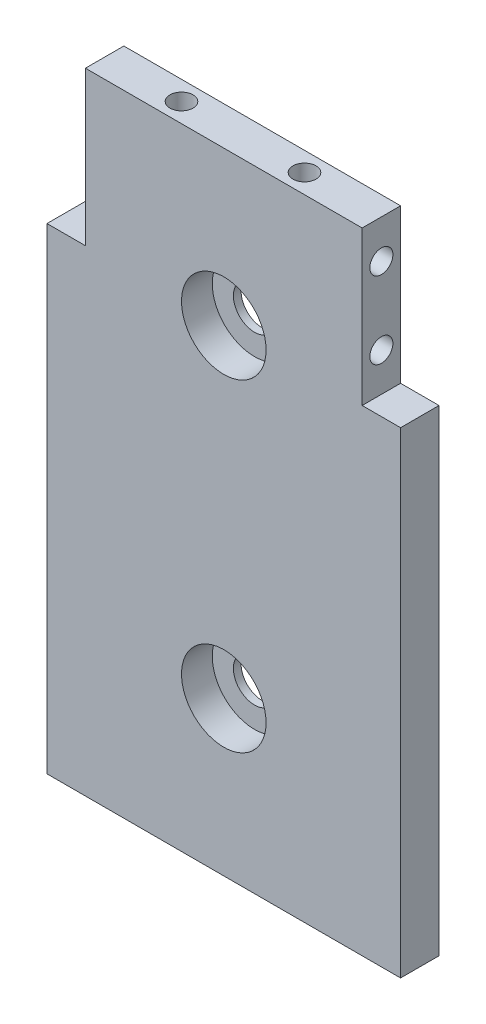
ISO-10303-21;
HEADER;
FILE_DESCRIPTION(('STEP AP214'),'2;1');
FILE_NAME('part.step','',(''),(''),'','','');
FILE_SCHEMA(('AUTOMOTIVE_DESIGN { 1 0 10303 214 1 1 1 1 }'));
ENDSEC;
DATA;
#1=APPLICATION_CONTEXT('core data for automotive mechanical design processes');
#2=APPLICATION_PROTOCOL_DEFINITION('international standard','automotive_design',2000,#1);
#3=PRODUCT_CONTEXT('',#1,'mechanical');
#4=PRODUCT('Part','Part','',(#3));
#5=PRODUCT_RELATED_PRODUCT_CATEGORY('part','',(#4));
#6=PRODUCT_DEFINITION_FORMATION('','',#4);
#7=PRODUCT_DEFINITION_CONTEXT('part definition',#1,'design');
#8=PRODUCT_DEFINITION('design','',#6,#7);
#9=PRODUCT_DEFINITION_SHAPE('','',#8);
#10=(LENGTH_UNIT() NAMED_UNIT(*) SI_UNIT(.MILLI.,.METRE.));
#11=(NAMED_UNIT(*) PLANE_ANGLE_UNIT() SI_UNIT($,.RADIAN.));
#12=(NAMED_UNIT(*) SI_UNIT($,.STERADIAN.) SOLID_ANGLE_UNIT());
#13=UNCERTAINTY_MEASURE_WITH_UNIT(LENGTH_MEASURE(1.E-05),#10,'distance_accuracy_value','');
#14=(GEOMETRIC_REPRESENTATION_CONTEXT(3) GLOBAL_UNCERTAINTY_ASSIGNED_CONTEXT((#13)) GLOBAL_UNIT_ASSIGNED_CONTEXT((#10,
#11,#12)) REPRESENTATION_CONTEXT('',''));
#15=CARTESIAN_POINT('',(0.,0.,0.));
#16=DIRECTION('',(0.,0.,1.));
#17=DIRECTION('',(1.,0.,0.));
#18=AXIS2_PLACEMENT_3D('',#15,#16,#17);
#19=CARTESIAN_POINT('',(23.,0.,5.));
#20=DIRECTION('',(0.,0.,-1.));
#21=DIRECTION('',(-1.,0.,0.));
#22=AXIS2_PLACEMENT_3D('',#19,#20,#21);
#23=CYLINDRICAL_SURFACE('',#22,2.75);
#24=CARTESIAN_POINT('',(23.,0.,0.));
#25=DIRECTION('',(0.,0.,1.));
#26=DIRECTION('',(1.,0.,0.));
#27=AXIS2_PLACEMENT_3D('',#24,#25,#26);
#28=CIRCLE('',#27,2.75);
#29=CARTESIAN_POINT('',(25.75,0.,0.));
#30=VERTEX_POINT('',#29);
#31=EDGE_CURVE('E135',#30,#30,#28,.T.);
#32=ORIENTED_EDGE('',*,*,#31,.F.);
#33=EDGE_LOOP('',(#32));
#34=FACE_BOUND('',#33,.T.);
#35=CARTESIAN_POINT('',(23.,0.,1.));
#36=DIRECTION('',(0.,0.,1.));
#37=DIRECTION('',(1.,0.,0.));
#38=AXIS2_PLACEMENT_3D('',#35,#36,#37);
#39=CIRCLE('',#38,2.75);
#40=CARTESIAN_POINT('',(25.75,0.,1.));
#41=VERTEX_POINT('',#40);
#42=EDGE_CURVE('E38',#41,#41,#39,.T.);
#43=ORIENTED_EDGE('',*,*,#42,.T.);
#44=EDGE_LOOP('',(#43));
#45=FACE_BOUND('',#44,.T.);
#46=ADVANCED_FACE('F35',(#34,#45),#23,.F.);
#47=CARTESIAN_POINT('',(23.,42.,5.));
#48=DIRECTION('',(0.,0.,-1.));
#49=DIRECTION('',(-1.,0.,0.));
#50=AXIS2_PLACEMENT_3D('',#47,#48,#49);
#51=CYLINDRICAL_SURFACE('',#50,2.75);
#52=CARTESIAN_POINT('',(23.,42.,0.));
#53=DIRECTION('',(0.,0.,1.));
#54=DIRECTION('',(1.,0.,0.));
#55=AXIS2_PLACEMENT_3D('',#52,#53,#54);
#56=CIRCLE('',#55,2.75);
#57=CARTESIAN_POINT('',(25.75,42.,0.));
#58=VERTEX_POINT('',#57);
#59=EDGE_CURVE('E155',#58,#58,#56,.T.);
#60=ORIENTED_EDGE('',*,*,#59,.F.);
#61=EDGE_LOOP('',(#60));
#62=FACE_BOUND('',#61,.T.);
#63=CARTESIAN_POINT('',(23.,42.,1.));
#64=DIRECTION('',(0.,0.,1.));
#65=DIRECTION('',(1.,0.,0.));
#66=AXIS2_PLACEMENT_3D('',#63,#64,#65);
#67=CIRCLE('',#66,2.75);
#68=CARTESIAN_POINT('',(25.75,42.,1.));
#69=VERTEX_POINT('',#68);
#70=EDGE_CURVE('E139',#69,#69,#67,.T.);
#71=ORIENTED_EDGE('',*,*,#70,.T.);
#72=EDGE_LOOP('',(#71));
#73=FACE_BOUND('',#72,.T.);
#74=ADVANCED_FACE('F204',(#62,#73),#51,.F.);
#75=CARTESIAN_POINT('',(0.,42.,5.));
#76=DIRECTION('',(0.,1.,0.));
#77=DIRECTION('',(0.,0.,1.));
#78=AXIS2_PLACEMENT_3D('',#75,#76,#77);
#79=PLANE('',#78);
#80=DIRECTION('',(1.,0.,0.));
#81=VECTOR('',#80,1.);
#82=CARTESIAN_POINT('',(0.,42.,0.));
#83=LINE('',#82,#81);
#84=CARTESIAN_POINT('',(41.,42.,0.));
#85=VERTEX_POINT('',#84);
#86=CARTESIAN_POINT('',(46.,42.,0.));
#87=VERTEX_POINT('',#86);
#88=EDGE_CURVE('E138',#85,#87,#83,.T.);
#89=ORIENTED_EDGE('',*,*,#88,.F.);
#90=DIRECTION('',(0.,0.,-1.));
#91=VECTOR('',#90,1.);
#92=CARTESIAN_POINT('',(41.,42.,5.));
#93=LINE('',#92,#91);
#94=CARTESIAN_POINT('',(41.,42.,5.));
#95=VERTEX_POINT('',#94);
#96=EDGE_CURVE('E11',#95,#85,#93,.T.);
#97=ORIENTED_EDGE('',*,*,#96,.F.);
#98=DIRECTION('',(1.,0.,0.));
#99=VECTOR('',#98,1.);
#100=CARTESIAN_POINT('',(0.,42.,5.));
#101=LINE('',#100,#99);
#102=CARTESIAN_POINT('',(46.,42.,5.));
#103=VERTEX_POINT('',#102);
#104=EDGE_CURVE('E130',#95,#103,#101,.T.);
#105=ORIENTED_EDGE('',*,*,#104,.T.);
#106=DIRECTION('',(0.,0.,-1.));
#107=VECTOR('',#106,1.);
#108=CARTESIAN_POINT('',(46.,42.,5.));
#109=LINE('',#108,#107);
#110=EDGE_CURVE('E88',#103,#87,#109,.T.);
#111=ORIENTED_EDGE('',*,*,#110,.T.);
#112=EDGE_LOOP('',(#89,#97,#105,#111));
#113=FACE_BOUND('',#112,.T.);
#114=ADVANCED_FACE('F206',(#113),#79,.T.);
#115=CARTESIAN_POINT('',(41.,0.,5.));
#116=DIRECTION('',(1.,0.,0.));
#117=DIRECTION('',(0.,0.,-1.));
#118=AXIS2_PLACEMENT_3D('',#115,#116,#117);
#119=PLANE('',#118);
#120=CARTESIAN_POINT('',(41.,57.,2.5));
#121=DIRECTION('',(1.,0.,0.));
#122=DIRECTION('',(0.,0.,-1.));
#123=AXIS2_PLACEMENT_3D('',#120,#121,#122);
#124=CIRCLE('',#123,1.5);
#125=CARTESIAN_POINT('',(41.,57.,0.999999999999999));
#126=VERTEX_POINT('',#125);
#127=EDGE_CURVE('E240',#126,#126,#124,.T.);
#128=ORIENTED_EDGE('',*,*,#127,.F.);
#129=EDGE_LOOP('',(#128));
#130=FACE_BOUND('',#129,.T.);
#131=CARTESIAN_POINT('',(41.,47.,2.5));
#132=DIRECTION('',(1.,0.,0.));
#133=DIRECTION('',(0.,0.,-1.));
#134=AXIS2_PLACEMENT_3D('',#131,#132,#133);
#135=CIRCLE('',#134,1.5);
#136=CARTESIAN_POINT('',(41.,47.,0.999999999999999));
#137=VERTEX_POINT('',#136);
#138=EDGE_CURVE('E244',#137,#137,#135,.T.);
#139=ORIENTED_EDGE('',*,*,#138,.F.);
#140=EDGE_LOOP('',(#139));
#141=FACE_BOUND('',#140,.T.);
#142=DIRECTION('',(0.,-1.,0.));
#143=VECTOR('',#142,1.);
#144=CARTESIAN_POINT('',(41.,0.,0.));
#145=LINE('',#144,#143);
#146=CARTESIAN_POINT('',(41.,62.,0.));
#147=VERTEX_POINT('',#146);
#148=EDGE_CURVE('E141',#147,#85,#145,.T.);
#149=ORIENTED_EDGE('',*,*,#148,.F.);
#150=DIRECTION('',(0.,0.,-1.));
#151=VECTOR('',#150,1.);
#152=CARTESIAN_POINT('',(41.,62.,5.));
#153=LINE('',#152,#151);
#154=CARTESIAN_POINT('',(41.,62.,5.));
#155=VERTEX_POINT('',#154);
#156=EDGE_CURVE('E44',#155,#147,#153,.T.);
#157=ORIENTED_EDGE('',*,*,#156,.F.);
#158=DIRECTION('',(0.,-1.,0.));
#159=VECTOR('',#158,1.);
#160=CARTESIAN_POINT('',(41.,0.,5.));
#161=LINE('',#160,#159);
#162=EDGE_CURVE('E180',#155,#95,#161,.T.);
#163=ORIENTED_EDGE('',*,*,#162,.T.);
#164=ORIENTED_EDGE('',*,*,#96,.T.);
#165=EDGE_LOOP('',(#149,#157,#163,#164));
#166=FACE_BOUND('',#165,.T.);
#167=ADVANCED_FACE('F212',(#130,#141,#166),#119,.T.);
#168=CARTESIAN_POINT('',(0.,62.,5.));
#169=DIRECTION('',(0.,1.,0.));
#170=DIRECTION('',(0.,0.,1.));
#171=AXIS2_PLACEMENT_3D('',#168,#169,#170);
#172=PLANE('',#171);
#173=CARTESIAN_POINT('',(31.,62.,2.5));
#174=DIRECTION('',(0.,1.,0.));
#175=DIRECTION('',(0.,0.,1.));
#176=AXIS2_PLACEMENT_3D('',#173,#174,#175);
#177=CIRCLE('',#176,1.5);
#178=CARTESIAN_POINT('',(31.,62.,4.));
#179=VERTEX_POINT('',#178);
#180=EDGE_CURVE('E380',#179,#179,#177,.T.);
#181=ORIENTED_EDGE('',*,*,#180,.F.);
#182=EDGE_LOOP('',(#181));
#183=FACE_BOUND('',#182,.T.);
#184=CARTESIAN_POINT('',(15.,62.,2.5));
#185=DIRECTION('',(0.,1.,0.));
#186=DIRECTION('',(0.,0.,1.));
#187=AXIS2_PLACEMENT_3D('',#184,#185,#186);
#188=CIRCLE('',#187,1.5);
#189=CARTESIAN_POINT('',(15.,62.,4.));
#190=VERTEX_POINT('',#189);
#191=EDGE_CURVE('E379',#190,#190,#188,.T.);
#192=ORIENTED_EDGE('',*,*,#191,.F.);
#193=EDGE_LOOP('',(#192));
#194=FACE_BOUND('',#193,.T.);
#195=DIRECTION('',(1.,0.,0.));
#196=VECTOR('',#195,1.);
#197=CARTESIAN_POINT('',(0.,62.,0.));
#198=LINE('',#197,#196);
#199=CARTESIAN_POINT('',(5.,62.,0.));
#200=VERTEX_POINT('',#199);
#201=EDGE_CURVE('E145',#200,#147,#198,.T.);
#202=ORIENTED_EDGE('',*,*,#201,.F.);
#203=DIRECTION('',(0.,0.,-1.));
#204=VECTOR('',#203,1.);
#205=CARTESIAN_POINT('',(5.,62.,5.));
#206=LINE('',#205,#204);
#207=CARTESIAN_POINT('',(5.,62.,5.));
#208=VERTEX_POINT('',#207);
#209=EDGE_CURVE('E163',#208,#200,#206,.T.);
#210=ORIENTED_EDGE('',*,*,#209,.F.);
#211=DIRECTION('',(1.,0.,0.));
#212=VECTOR('',#211,1.);
#213=CARTESIAN_POINT('',(0.,62.,5.));
#214=LINE('',#213,#212);
#215=EDGE_CURVE('E182',#208,#155,#214,.T.);
#216=ORIENTED_EDGE('',*,*,#215,.T.);
#217=ORIENTED_EDGE('',*,*,#156,.T.);
#218=EDGE_LOOP('',(#202,#210,#216,#217));
#219=FACE_BOUND('',#218,.T.);
#220=ADVANCED_FACE('F229',(#183,#194,#219),#172,.T.);
#221=CARTESIAN_POINT('',(5.,0.,5.));
#222=DIRECTION('',(1.,0.,0.));
#223=DIRECTION('',(0.,0.,-1.));
#224=AXIS2_PLACEMENT_3D('',#221,#222,#223);
#225=PLANE('',#224);
#226=CARTESIAN_POINT('',(5.,57.,2.5));
#227=DIRECTION('',(-1.,0.,0.));
#228=DIRECTION('',(0.,0.,1.));
#229=AXIS2_PLACEMENT_3D('',#226,#227,#228);
#230=CIRCLE('',#229,1.5);
#231=CARTESIAN_POINT('',(5.,57.,4.));
#232=VERTEX_POINT('',#231);
#233=EDGE_CURVE('E252',#232,#232,#230,.T.);
#234=ORIENTED_EDGE('',*,*,#233,.F.);
#235=EDGE_LOOP('',(#234));
#236=FACE_BOUND('',#235,.T.);
#237=CARTESIAN_POINT('',(5.,47.,2.5));
#238=DIRECTION('',(-1.,0.,0.));
#239=DIRECTION('',(0.,0.,1.));
#240=AXIS2_PLACEMENT_3D('',#237,#238,#239);
#241=CIRCLE('',#240,1.5);
#242=CARTESIAN_POINT('',(5.,47.,4.));
#243=VERTEX_POINT('',#242);
#244=EDGE_CURVE('E261',#243,#243,#241,.T.);
#245=ORIENTED_EDGE('',*,*,#244,.F.);
#246=EDGE_LOOP('',(#245));
#247=FACE_BOUND('',#246,.T.);
#248=DIRECTION('',(0.,-1.,0.));
#249=VECTOR('',#248,1.);
#250=CARTESIAN_POINT('',(5.,0.,0.));
#251=LINE('',#250,#249);
#252=CARTESIAN_POINT('',(5.,42.,0.));
#253=VERTEX_POINT('',#252);
#254=EDGE_CURVE('E148',#200,#253,#251,.T.);
#255=ORIENTED_EDGE('',*,*,#254,.T.);
#256=DIRECTION('',(0.,0.,-1.));
#257=VECTOR('',#256,1.);
#258=CARTESIAN_POINT('',(5.,42.,5.));
#259=LINE('',#258,#257);
#260=CARTESIAN_POINT('',(5.,42.,5.));
#261=VERTEX_POINT('',#260);
#262=EDGE_CURVE('E161',#261,#253,#259,.T.);
#263=ORIENTED_EDGE('',*,*,#262,.F.);
#264=DIRECTION('',(0.,-1.,0.));
#265=VECTOR('',#264,1.);
#266=CARTESIAN_POINT('',(5.,0.,5.));
#267=LINE('',#266,#265);
#268=EDGE_CURVE('E128',#208,#261,#267,.T.);
#269=ORIENTED_EDGE('',*,*,#268,.F.);
#270=ORIENTED_EDGE('',*,*,#209,.T.);
#271=EDGE_LOOP('',(#255,#263,#269,#270));
#272=FACE_BOUND('',#271,.T.);
#273=ADVANCED_FACE('F190',(#236,#247,#272),#225,.F.);
#274=CARTESIAN_POINT('',(0.,42.,0.));
#275=VERTEX_POINT('',#274);
#276=EDGE_CURVE('E142',#275,#253,#83,.T.);
#277=ORIENTED_EDGE('',*,*,#276,.F.);
#278=DIRECTION('',(0.,0.,-1.));
#279=VECTOR('',#278,1.);
#280=CARTESIAN_POINT('',(0.,42.,5.));
#281=LINE('',#280,#279);
#282=CARTESIAN_POINT('',(0.,42.,5.));
#283=VERTEX_POINT('',#282);
#284=EDGE_CURVE('E116',#283,#275,#281,.T.);
#285=ORIENTED_EDGE('',*,*,#284,.F.);
#286=EDGE_CURVE('E126',#283,#261,#101,.T.);
#287=ORIENTED_EDGE('',*,*,#286,.T.);
#288=ORIENTED_EDGE('',*,*,#262,.T.);
#289=EDGE_LOOP('',(#277,#285,#287,#288));
#290=FACE_BOUND('',#289,.T.);
#291=ADVANCED_FACE('F195',(#290),#79,.T.);
#292=CARTESIAN_POINT('',(0.,0.,5.));
#293=DIRECTION('',(-1.,0.,0.));
#294=DIRECTION('',(0.,0.,1.));
#295=AXIS2_PLACEMENT_3D('',#292,#293,#294);
#296=PLANE('',#295);
#297=DIRECTION('',(0.,1.,0.));
#298=VECTOR('',#297,1.);
#299=CARTESIAN_POINT('',(0.,0.,0.));
#300=LINE('',#299,#298);
#301=CARTESIAN_POINT('',(0.,-20.,0.));
#302=VERTEX_POINT('',#301);
#303=EDGE_CURVE('E113',#302,#275,#300,.T.);
#304=ORIENTED_EDGE('',*,*,#303,.F.);
#305=DIRECTION('',(0.,0.,-1.));
#306=VECTOR('',#305,1.);
#307=CARTESIAN_POINT('',(0.,-20.,5.));
#308=LINE('',#307,#306);
#309=CARTESIAN_POINT('',(0.,-20.,5.));
#310=VERTEX_POINT('',#309);
#311=EDGE_CURVE('E107',#310,#302,#308,.T.);
#312=ORIENTED_EDGE('',*,*,#311,.F.);
#313=DIRECTION('',(0.,1.,0.));
#314=VECTOR('',#313,1.);
#315=CARTESIAN_POINT('',(0.,0.,5.));
#316=LINE('',#315,#314);
#317=EDGE_CURVE('E111',#310,#283,#316,.T.);
#318=ORIENTED_EDGE('',*,*,#317,.T.);
#319=ORIENTED_EDGE('',*,*,#284,.T.);
#320=EDGE_LOOP('',(#304,#312,#318,#319));
#321=FACE_BOUND('',#320,.T.);
#322=ADVANCED_FACE('F109',(#321),#296,.T.);
#323=CARTESIAN_POINT('',(0.,-20.,5.));
#324=DIRECTION('',(0.,1.,0.));
#325=DIRECTION('',(0.,0.,1.));
#326=AXIS2_PLACEMENT_3D('',#323,#324,#325);
#327=PLANE('',#326);
#328=CARTESIAN_POINT('',(41.,-20.,2.5));
#329=DIRECTION('',(0.,-1.,0.));
#330=DIRECTION('',(0.,0.,-1.));
#331=AXIS2_PLACEMENT_3D('',#328,#329,#330);
#332=CIRCLE('',#331,1.5);
#333=CARTESIAN_POINT('',(41.,-20.,0.999999999999996));
#334=VERTEX_POINT('',#333);
#335=EDGE_CURVE('E267',#334,#334,#332,.T.);
#336=ORIENTED_EDGE('',*,*,#335,.F.);
#337=EDGE_LOOP('',(#336));
#338=FACE_BOUND('',#337,.T.);
#339=CARTESIAN_POINT('',(5.,-20.,2.5));
#340=DIRECTION('',(0.,-1.,0.));
#341=DIRECTION('',(0.,0.,-1.));
#342=AXIS2_PLACEMENT_3D('',#339,#340,#341);
#343=CIRCLE('',#342,1.5);
#344=CARTESIAN_POINT('',(5.,-20.,1.));
#345=VERTEX_POINT('',#344);
#346=EDGE_CURVE('E273',#345,#345,#343,.T.);
#347=ORIENTED_EDGE('',*,*,#346,.F.);
#348=EDGE_LOOP('',(#347));
#349=FACE_BOUND('',#348,.T.);
#350=DIRECTION('',(1.,0.,0.));
#351=VECTOR('',#350,1.);
#352=CARTESIAN_POINT('',(0.,-20.,0.));
#353=LINE('',#352,#351);
#354=CARTESIAN_POINT('',(46.,-20.,0.));
#355=VERTEX_POINT('',#354);
#356=EDGE_CURVE('E152',#302,#355,#353,.T.);
#357=ORIENTED_EDGE('',*,*,#356,.T.);
#358=DIRECTION('',(0.,0.,-1.));
#359=VECTOR('',#358,1.);
#360=CARTESIAN_POINT('',(46.,-20.,5.));
#361=LINE('',#360,#359);
#362=CARTESIAN_POINT('',(46.,-20.,5.));
#363=VERTEX_POINT('',#362);
#364=EDGE_CURVE('E117',#363,#355,#361,.T.);
#365=ORIENTED_EDGE('',*,*,#364,.F.);
#366=DIRECTION('',(1.,0.,0.));
#367=VECTOR('',#366,1.);
#368=CARTESIAN_POINT('',(0.,-20.,5.));
#369=LINE('',#368,#367);
#370=EDGE_CURVE('E120',#310,#363,#369,.T.);
#371=ORIENTED_EDGE('',*,*,#370,.F.);
#372=ORIENTED_EDGE('',*,*,#311,.T.);
#373=EDGE_LOOP('',(#357,#365,#371,#372));
#374=FACE_BOUND('',#373,.T.);
#375=ADVANCED_FACE('F121',(#338,#349,#374),#327,.F.);
#376=CARTESIAN_POINT('',(46.,0.,5.));
#377=DIRECTION('',(-1.,0.,0.));
#378=DIRECTION('',(0.,0.,1.));
#379=AXIS2_PLACEMENT_3D('',#376,#377,#378);
#380=PLANE('',#379);
#381=DIRECTION('',(0.,1.,0.));
#382=VECTOR('',#381,1.);
#383=CARTESIAN_POINT('',(46.,0.,0.));
#384=LINE('',#383,#382);
#385=EDGE_CURVE('E81',#355,#87,#384,.T.);
#386=ORIENTED_EDGE('',*,*,#385,.T.);
#387=ORIENTED_EDGE('',*,*,#110,.F.);
#388=DIRECTION('',(0.,1.,0.));
#389=VECTOR('',#388,1.);
#390=CARTESIAN_POINT('',(46.,0.,5.));
#391=LINE('',#390,#389);
#392=EDGE_CURVE('E53',#363,#103,#391,.T.);
#393=ORIENTED_EDGE('',*,*,#392,.F.);
#394=ORIENTED_EDGE('',*,*,#364,.T.);
#395=EDGE_LOOP('',(#386,#387,#393,#394));
#396=FACE_BOUND('',#395,.T.);
#397=ADVANCED_FACE('F217',(#396),#380,.F.);
#398=CARTESIAN_POINT('',(0.,0.,5.));
#399=DIRECTION('',(0.,0.,1.));
#400=DIRECTION('',(1.,0.,0.));
#401=AXIS2_PLACEMENT_3D('',#398,#399,#400);
#402=PLANE('',#401);
#403=CARTESIAN_POINT('',(23.,0.,5.));
#404=DIRECTION('',(0.,0.,1.));
#405=DIRECTION('',(1.,0.,0.));
#406=AXIS2_PLACEMENT_3D('',#403,#404,#405);
#407=CIRCLE('',#406,5.5);
#408=CARTESIAN_POINT('',(28.5,0.,5.));
#409=VERTEX_POINT('',#408);
#410=EDGE_CURVE('E177',#409,#409,#407,.T.);
#411=ORIENTED_EDGE('',*,*,#410,.F.);
#412=EDGE_LOOP('',(#411));
#413=FACE_BOUND('',#412,.T.);
#414=CARTESIAN_POINT('',(23.,42.,5.));
#415=DIRECTION('',(0.,0.,1.));
#416=DIRECTION('',(1.,0.,0.));
#417=AXIS2_PLACEMENT_3D('',#414,#415,#416);
#418=CIRCLE('',#417,5.5);
#419=CARTESIAN_POINT('',(28.5,42.,5.));
#420=VERTEX_POINT('',#419);
#421=EDGE_CURVE('E170',#420,#420,#418,.T.);
#422=ORIENTED_EDGE('',*,*,#421,.F.);
#423=EDGE_LOOP('',(#422));
#424=FACE_BOUND('',#423,.T.);
#425=ORIENTED_EDGE('',*,*,#104,.F.);
#426=ORIENTED_EDGE('',*,*,#162,.F.);
#427=ORIENTED_EDGE('',*,*,#215,.F.);
#428=ORIENTED_EDGE('',*,*,#268,.T.);
#429=ORIENTED_EDGE('',*,*,#286,.F.);
#430=ORIENTED_EDGE('',*,*,#317,.F.);
#431=ORIENTED_EDGE('',*,*,#370,.T.);
#432=ORIENTED_EDGE('',*,*,#392,.T.);
#433=EDGE_LOOP('',(#425,#426,#427,#428,#429,#430,#431,#432));
#434=FACE_BOUND('',#433,.T.);
#435=ADVANCED_FACE('F124',(#413,#424,#434),#402,.T.);
#436=CARTESIAN_POINT('',(0.,0.,0.));
#437=DIRECTION('',(0.,0.,1.));
#438=DIRECTION('',(1.,0.,0.));
#439=AXIS2_PLACEMENT_3D('',#436,#437,#438);
#440=PLANE('',#439);
#441=ORIENTED_EDGE('',*,*,#31,.T.);
#442=EDGE_LOOP('',(#441));
#443=FACE_BOUND('',#442,.T.);
#444=ORIENTED_EDGE('',*,*,#88,.T.);
#445=ORIENTED_EDGE('',*,*,#385,.F.);
#446=ORIENTED_EDGE('',*,*,#356,.F.);
#447=ORIENTED_EDGE('',*,*,#303,.T.);
#448=ORIENTED_EDGE('',*,*,#276,.T.);
#449=ORIENTED_EDGE('',*,*,#254,.F.);
#450=ORIENTED_EDGE('',*,*,#201,.T.);
#451=ORIENTED_EDGE('',*,*,#148,.T.);
#452=EDGE_LOOP('',(#444,#445,#446,#447,#448,#449,#450,#451));
#453=FACE_BOUND('',#452,.T.);
#454=ORIENTED_EDGE('',*,*,#59,.T.);
#455=EDGE_LOOP('',(#454));
#456=FACE_BOUND('',#455,.T.);
#457=ADVANCED_FACE('F196',(#443,#453,#456),#440,.F.);
#458=CARTESIAN_POINT('',(23.,42.,1.));
#459=DIRECTION('',(0.,0.,1.));
#460=DIRECTION('',(1.,0.,0.));
#461=AXIS2_PLACEMENT_3D('',#458,#459,#460);
#462=CYLINDRICAL_SURFACE('',#461,5.5);
#463=CARTESIAN_POINT('',(23.,42.,1.));
#464=DIRECTION('',(0.,0.,1.));
#465=DIRECTION('',(1.,0.,0.));
#466=AXIS2_PLACEMENT_3D('',#463,#464,#465);
#467=CIRCLE('',#466,5.5);
#468=CARTESIAN_POINT('',(28.5,42.,1.));
#469=VERTEX_POINT('',#468);
#470=EDGE_CURVE('E166',#469,#469,#467,.T.);
#471=ORIENTED_EDGE('',*,*,#470,.F.);
#472=EDGE_LOOP('',(#471));
#473=FACE_BOUND('',#472,.T.);
#474=ORIENTED_EDGE('',*,*,#421,.T.);
#475=EDGE_LOOP('',(#474));
#476=FACE_BOUND('',#475,.T.);
#477=ADVANCED_FACE('F199',(#473,#476),#462,.F.);
#478=CARTESIAN_POINT('',(23.,42.,1.));
#479=DIRECTION('',(0.,0.,1.));
#480=DIRECTION('',(1.,0.,0.));
#481=AXIS2_PLACEMENT_3D('',#478,#479,#480);
#482=PLANE('',#481);
#483=ORIENTED_EDGE('',*,*,#70,.F.);
#484=EDGE_LOOP('',(#483));
#485=FACE_BOUND('',#484,.T.);
#486=ORIENTED_EDGE('',*,*,#470,.T.);
#487=EDGE_LOOP('',(#486));
#488=FACE_BOUND('',#487,.T.);
#489=ADVANCED_FACE('F295',(#485,#488),#482,.T.);
#490=CARTESIAN_POINT('',(23.,0.,1.));
#491=DIRECTION('',(0.,0.,1.));
#492=DIRECTION('',(1.,0.,0.));
#493=AXIS2_PLACEMENT_3D('',#490,#491,#492);
#494=CYLINDRICAL_SURFACE('',#493,5.5);
#495=CARTESIAN_POINT('',(23.,0.,1.));
#496=DIRECTION('',(0.,0.,1.));
#497=DIRECTION('',(1.,0.,0.));
#498=AXIS2_PLACEMENT_3D('',#495,#496,#497);
#499=CIRCLE('',#498,5.5);
#500=CARTESIAN_POINT('',(28.5,0.,1.));
#501=VERTEX_POINT('',#500);
#502=EDGE_CURVE('E280',#501,#501,#499,.T.);
#503=ORIENTED_EDGE('',*,*,#502,.F.);
#504=EDGE_LOOP('',(#503));
#505=FACE_BOUND('',#504,.T.);
#506=ORIENTED_EDGE('',*,*,#410,.T.);
#507=EDGE_LOOP('',(#506));
#508=FACE_BOUND('',#507,.T.);
#509=ADVANCED_FACE('F288',(#505,#508),#494,.F.);
#510=CARTESIAN_POINT('',(23.,0.,1.));
#511=DIRECTION('',(0.,0.,1.));
#512=DIRECTION('',(1.,0.,0.));
#513=AXIS2_PLACEMENT_3D('',#510,#511,#512);
#514=PLANE('',#513);
#515=ORIENTED_EDGE('',*,*,#42,.F.);
#516=EDGE_LOOP('',(#515));
#517=FACE_BOUND('',#516,.T.);
#518=ORIENTED_EDGE('',*,*,#502,.T.);
#519=EDGE_LOOP('',(#518));
#520=FACE_BOUND('',#519,.T.);
#521=ADVANCED_FACE('F306',(#517,#520),#514,.T.);
#522=CARTESIAN_POINT('',(5.,-13.,2.5));
#523=DIRECTION('',(0.,-1.,0.));
#524=DIRECTION('',(0.,0.,-1.));
#525=AXIS2_PLACEMENT_3D('',#522,#523,#524);
#526=CYLINDRICAL_SURFACE('',#525,1.5);
#527=CARTESIAN_POINT('',(5.,-13.,2.5));
#528=DIRECTION('',(0.,-1.,0.));
#529=DIRECTION('',(0.,0.,-1.));
#530=AXIS2_PLACEMENT_3D('',#527,#528,#529);
#531=CIRCLE('',#530,1.5);
#532=CARTESIAN_POINT('',(5.,-13.,1.));
#533=VERTEX_POINT('',#532);
#534=EDGE_CURVE('E276',#533,#533,#531,.T.);
#535=ORIENTED_EDGE('',*,*,#534,.F.);
#536=EDGE_LOOP('',(#535));
#537=FACE_BOUND('',#536,.T.);
#538=ORIENTED_EDGE('',*,*,#346,.T.);
#539=EDGE_LOOP('',(#538));
#540=FACE_BOUND('',#539,.T.);
#541=ADVANCED_FACE('F310',(#537,#540),#526,.F.);
#542=CARTESIAN_POINT('',(5.,-13.,2.5));
#543=DIRECTION('',(0.,-1.,0.));
#544=DIRECTION('',(0.,0.,-1.));
#545=AXIS2_PLACEMENT_3D('',#542,#543,#544);
#546=PLANE('',#545);
#547=ORIENTED_EDGE('',*,*,#534,.T.);
#548=EDGE_LOOP('',(#547));
#549=FACE_BOUND('',#548,.T.);
#550=ADVANCED_FACE('F314',(#549),#546,.T.);
#551=CARTESIAN_POINT('',(41.,-13.,2.5));
#552=DIRECTION('',(0.,-1.,0.));
#553=DIRECTION('',(0.,0.,-1.));
#554=AXIS2_PLACEMENT_3D('',#551,#552,#553);
#555=CYLINDRICAL_SURFACE('',#554,1.5);
#556=CARTESIAN_POINT('',(41.,-13.,2.5));
#557=DIRECTION('',(0.,-1.,0.));
#558=DIRECTION('',(0.,0.,-1.));
#559=AXIS2_PLACEMENT_3D('',#556,#557,#558);
#560=CIRCLE('',#559,1.5);
#561=CARTESIAN_POINT('',(41.,-13.,0.999999999999996));
#562=VERTEX_POINT('',#561);
#563=EDGE_CURVE('E270',#562,#562,#560,.T.);
#564=ORIENTED_EDGE('',*,*,#563,.F.);
#565=EDGE_LOOP('',(#564));
#566=FACE_BOUND('',#565,.T.);
#567=ORIENTED_EDGE('',*,*,#335,.T.);
#568=EDGE_LOOP('',(#567));
#569=FACE_BOUND('',#568,.T.);
#570=ADVANCED_FACE('F318',(#566,#569),#555,.F.);
#571=CARTESIAN_POINT('',(41.,-13.,2.5));
#572=DIRECTION('',(0.,-1.,0.));
#573=DIRECTION('',(0.,0.,-1.));
#574=AXIS2_PLACEMENT_3D('',#571,#572,#573);
#575=PLANE('',#574);
#576=ORIENTED_EDGE('',*,*,#563,.T.);
#577=EDGE_LOOP('',(#576));
#578=FACE_BOUND('',#577,.T.);
#579=ADVANCED_FACE('F322',(#578),#575,.T.);
#580=CARTESIAN_POINT('',(12.,47.,2.5));
#581=DIRECTION('',(-1.,0.,0.));
#582=DIRECTION('',(0.,0.,1.));
#583=AXIS2_PLACEMENT_3D('',#580,#581,#582);
#584=CYLINDRICAL_SURFACE('',#583,1.5);
#585=CARTESIAN_POINT('',(12.,47.,2.5));
#586=DIRECTION('',(-1.,0.,0.));
#587=DIRECTION('',(0.,0.,1.));
#588=AXIS2_PLACEMENT_3D('',#585,#586,#587);
#589=CIRCLE('',#588,1.5);
#590=CARTESIAN_POINT('',(12.,47.,4.));
#591=VERTEX_POINT('',#590);
#592=EDGE_CURVE('E264',#591,#591,#589,.T.);
#593=ORIENTED_EDGE('',*,*,#592,.F.);
#594=EDGE_LOOP('',(#593));
#595=FACE_BOUND('',#594,.T.);
#596=ORIENTED_EDGE('',*,*,#244,.T.);
#597=EDGE_LOOP('',(#596));
#598=FACE_BOUND('',#597,.T.);
#599=ADVANCED_FACE('F326',(#595,#598),#584,.F.);
#600=CARTESIAN_POINT('',(12.,47.,2.5));
#601=DIRECTION('',(-1.,0.,0.));
#602=DIRECTION('',(0.,0.,1.));
#603=AXIS2_PLACEMENT_3D('',#600,#601,#602);
#604=PLANE('',#603);
#605=ORIENTED_EDGE('',*,*,#592,.T.);
#606=EDGE_LOOP('',(#605));
#607=FACE_BOUND('',#606,.T.);
#608=ADVANCED_FACE('F330',(#607),#604,.T.);
#609=CARTESIAN_POINT('',(12.,57.,2.5));
#610=DIRECTION('',(-1.,0.,0.));
#611=DIRECTION('',(0.,0.,1.));
#612=AXIS2_PLACEMENT_3D('',#609,#610,#611);
#613=CYLINDRICAL_SURFACE('',#612,1.5);
#614=CARTESIAN_POINT('',(12.,57.,2.5));
#615=DIRECTION('',(-1.,0.,0.));
#616=DIRECTION('',(0.,0.,1.));
#617=AXIS2_PLACEMENT_3D('',#614,#615,#616);
#618=CIRCLE('',#617,1.5);
#619=CARTESIAN_POINT('',(12.,57.,4.));
#620=VERTEX_POINT('',#619);
#621=EDGE_CURVE('E258',#620,#620,#618,.T.);
#622=ORIENTED_EDGE('',*,*,#621,.F.);
#623=EDGE_LOOP('',(#622));
#624=FACE_BOUND('',#623,.T.);
#625=ORIENTED_EDGE('',*,*,#233,.T.);
#626=EDGE_LOOP('',(#625));
#627=FACE_BOUND('',#626,.T.);
#628=ADVANCED_FACE('F334',(#624,#627),#613,.F.);
#629=CARTESIAN_POINT('',(12.,57.,2.5));
#630=DIRECTION('',(-1.,0.,0.));
#631=DIRECTION('',(0.,0.,1.));
#632=AXIS2_PLACEMENT_3D('',#629,#630,#631);
#633=PLANE('',#632);
#634=ORIENTED_EDGE('',*,*,#621,.T.);
#635=EDGE_LOOP('',(#634));
#636=FACE_BOUND('',#635,.T.);
#637=ADVANCED_FACE('F338',(#636),#633,.T.);
#638=CARTESIAN_POINT('',(34.,47.,2.5));
#639=DIRECTION('',(1.,0.,0.));
#640=DIRECTION('',(0.,0.,-1.));
#641=AXIS2_PLACEMENT_3D('',#638,#639,#640);
#642=CYLINDRICAL_SURFACE('',#641,1.5);
#643=CARTESIAN_POINT('',(34.,47.,2.5));
#644=DIRECTION('',(1.,0.,0.));
#645=DIRECTION('',(0.,0.,-1.));
#646=AXIS2_PLACEMENT_3D('',#643,#644,#645);
#647=CIRCLE('',#646,1.5);
#648=CARTESIAN_POINT('',(34.,47.,0.999999999999999));
#649=VERTEX_POINT('',#648);
#650=EDGE_CURVE('E248',#649,#649,#647,.T.);
#651=ORIENTED_EDGE('',*,*,#650,.F.);
#652=EDGE_LOOP('',(#651));
#653=FACE_BOUND('',#652,.T.);
#654=ORIENTED_EDGE('',*,*,#138,.T.);
#655=EDGE_LOOP('',(#654));
#656=FACE_BOUND('',#655,.T.);
#657=ADVANCED_FACE('F342',(#653,#656),#642,.F.);
#658=CARTESIAN_POINT('',(34.,47.,2.5));
#659=DIRECTION('',(1.,0.,0.));
#660=DIRECTION('',(0.,0.,-1.));
#661=AXIS2_PLACEMENT_3D('',#658,#659,#660);
#662=PLANE('',#661);
#663=ORIENTED_EDGE('',*,*,#650,.T.);
#664=EDGE_LOOP('',(#663));
#665=FACE_BOUND('',#664,.T.);
#666=ADVANCED_FACE('F346',(#665),#662,.T.);
#667=CARTESIAN_POINT('',(34.,57.,2.5));
#668=DIRECTION('',(1.,0.,0.));
#669=DIRECTION('',(0.,0.,-1.));
#670=AXIS2_PLACEMENT_3D('',#667,#668,#669);
#671=CYLINDRICAL_SURFACE('',#670,1.5);
#672=CARTESIAN_POINT('',(34.,57.,2.5));
#673=DIRECTION('',(1.,0.,0.));
#674=DIRECTION('',(0.,0.,-1.));
#675=AXIS2_PLACEMENT_3D('',#672,#673,#674);
#676=CIRCLE('',#675,1.5);
#677=CARTESIAN_POINT('',(34.,57.,0.999999999999999));
#678=VERTEX_POINT('',#677);
#679=EDGE_CURVE('E249',#678,#678,#676,.T.);
#680=ORIENTED_EDGE('',*,*,#679,.F.);
#681=EDGE_LOOP('',(#680));
#682=FACE_BOUND('',#681,.T.);
#683=ORIENTED_EDGE('',*,*,#127,.T.);
#684=EDGE_LOOP('',(#683));
#685=FACE_BOUND('',#684,.T.);
#686=ADVANCED_FACE('F350',(#682,#685),#671,.F.);
#687=CARTESIAN_POINT('',(34.,57.,2.5));
#688=DIRECTION('',(1.,0.,0.));
#689=DIRECTION('',(0.,0.,-1.));
#690=AXIS2_PLACEMENT_3D('',#687,#688,#689);
#691=PLANE('',#690);
#692=ORIENTED_EDGE('',*,*,#679,.T.);
#693=EDGE_LOOP('',(#692));
#694=FACE_BOUND('',#693,.T.);
#695=ADVANCED_FACE('F354',(#694),#691,.T.);
#696=CARTESIAN_POINT('',(15.,55.,2.5));
#697=DIRECTION('',(0.,1.,0.));
#698=DIRECTION('',(0.,0.,1.));
#699=AXIS2_PLACEMENT_3D('',#696,#697,#698);
#700=CYLINDRICAL_SURFACE('',#699,1.5);
#701=CARTESIAN_POINT('',(15.,55.,2.5));
#702=DIRECTION('',(0.,1.,0.));
#703=DIRECTION('',(0.,0.,1.));
#704=AXIS2_PLACEMENT_3D('',#701,#702,#703);
#705=CIRCLE('',#704,1.5);
#706=CARTESIAN_POINT('',(15.,55.,4.));
#707=VERTEX_POINT('',#706);
#708=EDGE_CURVE('E383',#707,#707,#705,.T.);
#709=ORIENTED_EDGE('',*,*,#708,.F.);
#710=EDGE_LOOP('',(#709));
#711=FACE_BOUND('',#710,.T.);
#712=ORIENTED_EDGE('',*,*,#191,.T.);
#713=EDGE_LOOP('',(#712));
#714=FACE_BOUND('',#713,.T.);
#715=ADVANCED_FACE('F358',(#711,#714),#700,.F.);
#716=CARTESIAN_POINT('',(15.,55.,2.5));
#717=DIRECTION('',(0.,1.,0.));
#718=DIRECTION('',(0.,0.,1.));
#719=AXIS2_PLACEMENT_3D('',#716,#717,#718);
#720=PLANE('',#719);
#721=ORIENTED_EDGE('',*,*,#708,.T.);
#722=EDGE_LOOP('',(#721));
#723=FACE_BOUND('',#722,.T.);
#724=ADVANCED_FACE('F362',(#723),#720,.T.);
#725=CARTESIAN_POINT('',(31.,55.,2.5));
#726=DIRECTION('',(0.,1.,0.));
#727=DIRECTION('',(0.,0.,1.));
#728=AXIS2_PLACEMENT_3D('',#725,#726,#727);
#729=CYLINDRICAL_SURFACE('',#728,1.5);
#730=CARTESIAN_POINT('',(31.,55.,2.5));
#731=DIRECTION('',(0.,1.,0.));
#732=DIRECTION('',(0.,0.,1.));
#733=AXIS2_PLACEMENT_3D('',#730,#731,#732);
#734=CIRCLE('',#733,1.5);
#735=CARTESIAN_POINT('',(31.,55.,4.));
#736=VERTEX_POINT('',#735);
#737=EDGE_CURVE('E378',#736,#736,#734,.T.);
#738=ORIENTED_EDGE('',*,*,#737,.F.);
#739=EDGE_LOOP('',(#738));
#740=FACE_BOUND('',#739,.T.);
#741=ORIENTED_EDGE('',*,*,#180,.T.);
#742=EDGE_LOOP('',(#741));
#743=FACE_BOUND('',#742,.T.);
#744=ADVANCED_FACE('F366',(#740,#743),#729,.F.);
#745=CARTESIAN_POINT('',(31.,55.,2.5));
#746=DIRECTION('',(0.,1.,0.));
#747=DIRECTION('',(0.,0.,1.));
#748=AXIS2_PLACEMENT_3D('',#745,#746,#747);
#749=PLANE('',#748);
#750=ORIENTED_EDGE('',*,*,#737,.T.);
#751=EDGE_LOOP('',(#750));
#752=FACE_BOUND('',#751,.T.);
#753=ADVANCED_FACE('F370',(#752),#749,.T.);
#754=CLOSED_SHELL('',(#46,#74,#114,#167,#220,#273,#291,#322,#375,#397,#435,#457,#477,#489,#509,
#521,#541,#550,#570,#579,#599,#608,#628,#637,#657,#666,#686,#695,#715,#724,#744,#753));
#755=MANIFOLD_SOLID_BREP('B2',#754);
#756=ADVANCED_BREP_SHAPE_REPRESENTATION('',(#18,#755),#14);
#757=SHAPE_DEFINITION_REPRESENTATION(#9,#756);
ENDSEC;
END-ISO-10303-21;
